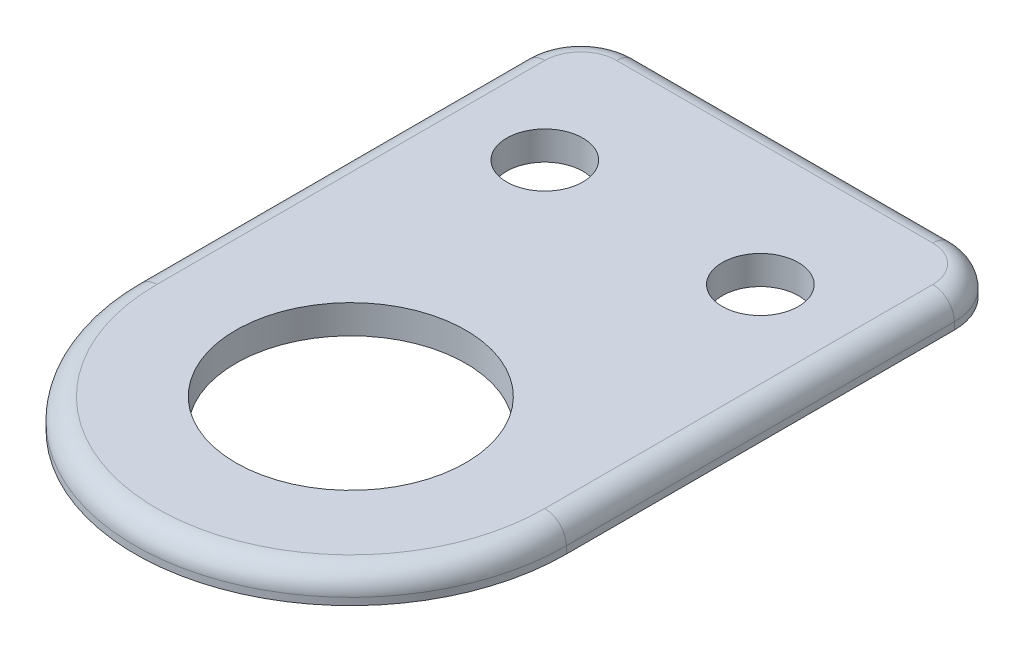
ISO-10303-21;
HEADER;
FILE_DESCRIPTION(('STEP AP214'),'2;1');
FILE_NAME('part.step','',(''),(''),'','','');
FILE_SCHEMA(('AUTOMOTIVE_DESIGN { 1 0 10303 214 1 1 1 1 }'));
ENDSEC;
DATA;
#1=APPLICATION_CONTEXT('core data for automotive mechanical design processes');
#2=APPLICATION_PROTOCOL_DEFINITION('international standard','automotive_design',2000,#1);
#3=PRODUCT_CONTEXT('',#1,'mechanical');
#4=PRODUCT('Part','Part','',(#3));
#5=PRODUCT_RELATED_PRODUCT_CATEGORY('part','',(#4));
#6=PRODUCT_DEFINITION_FORMATION('','',#4);
#7=PRODUCT_DEFINITION_CONTEXT('part definition',#1,'design');
#8=PRODUCT_DEFINITION('design','',#6,#7);
#9=PRODUCT_DEFINITION_SHAPE('','',#8);
#10=(LENGTH_UNIT() NAMED_UNIT(*) SI_UNIT(.MILLI.,.METRE.));
#11=(NAMED_UNIT(*) PLANE_ANGLE_UNIT() SI_UNIT($,.RADIAN.));
#12=(NAMED_UNIT(*) SI_UNIT($,.STERADIAN.) SOLID_ANGLE_UNIT());
#13=UNCERTAINTY_MEASURE_WITH_UNIT(LENGTH_MEASURE(1.E-05),#10,'distance_accuracy_value','');
#14=(GEOMETRIC_REPRESENTATION_CONTEXT(3) GLOBAL_UNCERTAINTY_ASSIGNED_CONTEXT((#13)) GLOBAL_UNIT_ASSIGNED_CONTEXT((#10,
#11,#12)) REPRESENTATION_CONTEXT('',''));
#15=CARTESIAN_POINT('',(0.,0.,0.));
#16=DIRECTION('',(0.,0.,1.));
#17=DIRECTION('',(1.,0.,0.));
#18=AXIS2_PLACEMENT_3D('',#15,#16,#17);
#19=CARTESIAN_POINT('',(0.,2.,0.));
#20=DIRECTION('',(0.,1.,0.));
#21=DIRECTION('',(0.,0.,1.));
#22=AXIS2_PLACEMENT_3D('',#19,#20,#21);
#23=PLANE('',#22);
#24=CARTESIAN_POINT('',(0.,2.,0.));
#25=DIRECTION('',(0.,1.,0.));
#26=DIRECTION('',(0.,0.,1.));
#27=AXIS2_PLACEMENT_3D('',#24,#25,#26);
#28=CIRCLE('',#27,13.5);
#29=CARTESIAN_POINT('',(-13.5,2.,0.));
#30=VERTEX_POINT('',#29);
#31=CARTESIAN_POINT('',(13.5,2.,0.));
#32=VERTEX_POINT('',#31);
#33=EDGE_CURVE('E196',#30,#32,#28,.T.);
#34=ORIENTED_EDGE('',*,*,#33,.T.);
#35=DIRECTION('',(0.,0.,-1.));
#36=VECTOR('',#35,1.);
#37=CARTESIAN_POINT('',(13.5,2.,-27.));
#38=LINE('',#37,#36);
#39=CARTESIAN_POINT('',(13.5,2.,-27.));
#40=VERTEX_POINT('',#39);
#41=EDGE_CURVE('E211',#32,#40,#38,.T.);
#42=ORIENTED_EDGE('',*,*,#41,.T.);
#43=CARTESIAN_POINT('',(11.,2.,-27.));
#44=DIRECTION('',(0.,1.,0.));
#45=DIRECTION('',(0.,0.,1.));
#46=AXIS2_PLACEMENT_3D('',#43,#44,#45);
#47=CIRCLE('',#46,2.5);
#48=CARTESIAN_POINT('',(11.,2.,-29.5));
#49=VERTEX_POINT('',#48);
#50=EDGE_CURVE('E208',#40,#49,#47,.T.);
#51=ORIENTED_EDGE('',*,*,#50,.T.);
#52=DIRECTION('',(1.,0.,0.));
#53=VECTOR('',#52,1.);
#54=CARTESIAN_POINT('',(0.,2.,-29.5));
#55=LINE('',#54,#53);
#56=CARTESIAN_POINT('',(-11.,2.,-29.5));
#57=VERTEX_POINT('',#56);
#58=EDGE_CURVE('E205',#49,#57,#55,.F.);
#59=ORIENTED_EDGE('',*,*,#58,.T.);
#60=CARTESIAN_POINT('',(-11.,2.,-27.));
#61=DIRECTION('',(0.,1.,0.));
#62=DIRECTION('',(0.,0.,1.));
#63=AXIS2_PLACEMENT_3D('',#60,#61,#62);
#64=CIRCLE('',#63,2.5);
#65=CARTESIAN_POINT('',(-13.5,2.,-27.));
#66=VERTEX_POINT('',#65);
#67=EDGE_CURVE('E202',#57,#66,#64,.T.);
#68=ORIENTED_EDGE('',*,*,#67,.T.);
#69=DIRECTION('',(0.,0.,-1.));
#70=VECTOR('',#69,1.);
#71=CARTESIAN_POINT('',(-13.5,2.,0.));
#72=LINE('',#71,#70);
#73=EDGE_CURVE('E199',#66,#30,#72,.F.);
#74=ORIENTED_EDGE('',*,*,#73,.T.);
#75=EDGE_LOOP('',(#34,#42,#51,#59,#68,#74));
#76=FACE_BOUND('',#75,.T.);
#77=CARTESIAN_POINT('',(-7.5,2.,-21.));
#78=DIRECTION('',(0.,1.,0.));
#79=DIRECTION('',(0.,0.,1.));
#80=AXIS2_PLACEMENT_3D('',#77,#78,#79);
#81=CIRCLE('',#80,2.65);
#82=CARTESIAN_POINT('',(-7.5,2.,-18.35));
#83=VERTEX_POINT('',#82);
#84=EDGE_CURVE('E250',#83,#83,#81,.T.);
#85=ORIENTED_EDGE('',*,*,#84,.F.);
#86=EDGE_LOOP('',(#85));
#87=FACE_BOUND('',#86,.T.);
#88=CARTESIAN_POINT('',(7.5,2.,-21.));
#89=DIRECTION('',(0.,1.,0.));
#90=DIRECTION('',(0.,0.,1.));
#91=AXIS2_PLACEMENT_3D('',#88,#89,#90);
#92=CIRCLE('',#91,2.65);
#93=CARTESIAN_POINT('',(7.5,2.,-18.35));
#94=VERTEX_POINT('',#93);
#95=EDGE_CURVE('E262',#94,#94,#92,.T.);
#96=ORIENTED_EDGE('',*,*,#95,.F.);
#97=EDGE_LOOP('',(#96));
#98=FACE_BOUND('',#97,.T.);
#99=CARTESIAN_POINT('',(0.,2.,0.));
#100=DIRECTION('',(0.,1.,0.));
#101=DIRECTION('',(0.,0.,1.));
#102=AXIS2_PLACEMENT_3D('',#99,#100,#101);
#103=CIRCLE('',#102,8.);
#104=CARTESIAN_POINT('',(0.,2.,8.));
#105=VERTEX_POINT('',#104);
#106=EDGE_CURVE('E164',#105,#105,#103,.T.);
#107=ORIENTED_EDGE('',*,*,#106,.F.);
#108=EDGE_LOOP('',(#107));
#109=FACE_BOUND('',#108,.T.);
#110=ADVANCED_FACE('F64',(#76,#87,#98,#109),#23,.T.);
#111=CARTESIAN_POINT('',(0.,0.,0.));
#112=DIRECTION('',(0.,1.,0.));
#113=DIRECTION('',(0.,0.,1.));
#114=AXIS2_PLACEMENT_3D('',#111,#112,#113);
#115=PLANE('',#114);
#116=CARTESIAN_POINT('',(-7.5,0.,-21.));
#117=DIRECTION('',(0.,1.,0.));
#118=DIRECTION('',(0.,0.,1.));
#119=AXIS2_PLACEMENT_3D('',#116,#117,#118);
#120=CIRCLE('',#119,2.65);
#121=CARTESIAN_POINT('',(-7.5,0.,-18.35));
#122=VERTEX_POINT('',#121);
#123=EDGE_CURVE('E256',#122,#122,#120,.T.);
#124=ORIENTED_EDGE('',*,*,#123,.T.);
#125=EDGE_LOOP('',(#124));
#126=FACE_BOUND('',#125,.T.);
#127=CARTESIAN_POINT('',(7.5,0.,-21.));
#128=DIRECTION('',(0.,1.,0.));
#129=DIRECTION('',(0.,0.,1.));
#130=AXIS2_PLACEMENT_3D('',#127,#128,#129);
#131=CIRCLE('',#130,2.65);
#132=CARTESIAN_POINT('',(7.5,0.,-18.35));
#133=VERTEX_POINT('',#132);
#134=EDGE_CURVE('E268',#133,#133,#131,.T.);
#135=ORIENTED_EDGE('',*,*,#134,.T.);
#136=EDGE_LOOP('',(#135));
#137=FACE_BOUND('',#136,.T.);
#138=DIRECTION('',(1.,0.,0.));
#139=VECTOR('',#138,1.);
#140=CARTESIAN_POINT('',(0.,0.,-31.));
#141=LINE('',#140,#139);
#142=CARTESIAN_POINT('',(-11.,0.,-31.));
#143=VERTEX_POINT('',#142);
#144=CARTESIAN_POINT('',(11.,0.,-31.));
#145=VERTEX_POINT('',#144);
#146=EDGE_CURVE('E160',#143,#145,#141,.T.);
#147=ORIENTED_EDGE('',*,*,#146,.T.);
#148=CARTESIAN_POINT('',(11.,0.,-27.));
#149=DIRECTION('',(0.,1.,0.));
#150=DIRECTION('',(0.,0.,1.));
#151=AXIS2_PLACEMENT_3D('',#148,#149,#150);
#152=CIRCLE('',#151,4.);
#153=CARTESIAN_POINT('',(15.,0.,-27.));
#154=VERTEX_POINT('',#153);
#155=EDGE_CURVE('E158',#145,#154,#152,.F.);
#156=ORIENTED_EDGE('',*,*,#155,.T.);
#157=DIRECTION('',(0.,0.,-1.));
#158=VECTOR('',#157,1.);
#159=CARTESIAN_POINT('',(15.,0.,0.));
#160=LINE('',#159,#158);
#161=CARTESIAN_POINT('',(15.,0.,0.));
#162=VERTEX_POINT('',#161);
#163=EDGE_CURVE('E140',#162,#154,#160,.T.);
#164=ORIENTED_EDGE('',*,*,#163,.F.);
#165=CARTESIAN_POINT('',(0.,0.,0.));
#166=DIRECTION('',(0.,1.,0.));
#167=DIRECTION('',(0.,0.,1.));
#168=AXIS2_PLACEMENT_3D('',#165,#166,#167);
#169=CIRCLE('',#168,15.);
#170=CARTESIAN_POINT('',(-15.,0.,0.));
#171=VERTEX_POINT('',#170);
#172=EDGE_CURVE('E155',#162,#171,#169,.F.);
#173=ORIENTED_EDGE('',*,*,#172,.T.);
#174=DIRECTION('',(0.,0.,-1.));
#175=VECTOR('',#174,1.);
#176=CARTESIAN_POINT('',(-15.,0.,0.));
#177=LINE('',#176,#175);
#178=CARTESIAN_POINT('',(-15.,0.,-27.));
#179=VERTEX_POINT('',#178);
#180=EDGE_CURVE('E174',#171,#179,#177,.T.);
#181=ORIENTED_EDGE('',*,*,#180,.T.);
#182=CARTESIAN_POINT('',(-11.,0.,-27.));
#183=DIRECTION('',(0.,1.,0.));
#184=DIRECTION('',(0.,0.,1.));
#185=AXIS2_PLACEMENT_3D('',#182,#183,#184);
#186=CIRCLE('',#185,4.);
#187=EDGE_CURVE('E185',#179,#143,#186,.F.);
#188=ORIENTED_EDGE('',*,*,#187,.T.);
#189=EDGE_LOOP('',(#147,#156,#164,#173,#181,#188));
#190=FACE_BOUND('',#189,.T.);
#191=CARTESIAN_POINT('',(0.,0.,0.));
#192=DIRECTION('',(0.,1.,0.));
#193=DIRECTION('',(0.,0.,1.));
#194=AXIS2_PLACEMENT_3D('',#191,#192,#193);
#195=CIRCLE('',#194,8.);
#196=CARTESIAN_POINT('',(0.,0.,8.));
#197=VERTEX_POINT('',#196);
#198=EDGE_CURVE('E168',#197,#197,#195,.T.);
#199=ORIENTED_EDGE('',*,*,#198,.T.);
#200=EDGE_LOOP('',(#199));
#201=FACE_BOUND('',#200,.T.);
#202=ADVANCED_FACE('F152',(#126,#137,#190,#201),#115,.F.);
#203=CARTESIAN_POINT('',(0.,2.,0.));
#204=DIRECTION('',(0.,-1.,0.));
#205=DIRECTION('',(0.,0.,-1.));
#206=AXIS2_PLACEMENT_3D('',#203,#204,#205);
#207=CYLINDRICAL_SURFACE('',#206,15.);
#208=DIRECTION('',(0.,-1.,0.));
#209=VECTOR('',#208,1.);
#210=CARTESIAN_POINT('',(15.,2.,0.));
#211=LINE('',#210,#209);
#212=CARTESIAN_POINT('',(15.,0.5,0.));
#213=VERTEX_POINT('',#212);
#214=EDGE_CURVE('E136',#213,#162,#211,.T.);
#215=ORIENTED_EDGE('',*,*,#214,.F.);
#216=CARTESIAN_POINT('',(0.,0.5,0.));
#217=DIRECTION('',(0.,1.,0.));
#218=DIRECTION('',(0.,0.,1.));
#219=AXIS2_PLACEMENT_3D('',#216,#217,#218);
#220=CIRCLE('',#219,15.);
#221=CARTESIAN_POINT('',(-15.,0.5,0.));
#222=VERTEX_POINT('',#221);
#223=EDGE_CURVE('E12',#213,#222,#220,.F.);
#224=ORIENTED_EDGE('',*,*,#223,.T.);
#225=DIRECTION('',(0.,-1.,0.));
#226=VECTOR('',#225,1.);
#227=CARTESIAN_POINT('',(-15.,2.,0.));
#228=LINE('',#227,#226);
#229=EDGE_CURVE('E147',#222,#171,#228,.T.);
#230=ORIENTED_EDGE('',*,*,#229,.T.);
#231=ORIENTED_EDGE('',*,*,#172,.F.);
#232=EDGE_LOOP('',(#215,#224,#230,#231));
#233=FACE_BOUND('',#232,.T.);
#234=ADVANCED_FACE('F162',(#233),#207,.T.);
#235=CARTESIAN_POINT('',(15.,2.,0.));
#236=DIRECTION('',(-1.,0.,0.));
#237=DIRECTION('',(0.,0.,1.));
#238=AXIS2_PLACEMENT_3D('',#235,#236,#237);
#239=PLANE('',#238);
#240=DIRECTION('',(0.,-1.,0.));
#241=VECTOR('',#240,1.);
#242=CARTESIAN_POINT('',(15.,2.,-27.));
#243=LINE('',#242,#241);
#244=CARTESIAN_POINT('',(15.,0.5,-27.));
#245=VERTEX_POINT('',#244);
#246=EDGE_CURVE('E190',#154,#245,#243,.F.);
#247=ORIENTED_EDGE('',*,*,#246,.T.);
#248=DIRECTION('',(0.,0.,-1.));
#249=VECTOR('',#248,1.);
#250=CARTESIAN_POINT('',(15.,0.5,0.));
#251=LINE('',#250,#249);
#252=EDGE_CURVE('E143',#245,#213,#251,.F.);
#253=ORIENTED_EDGE('',*,*,#252,.T.);
#254=ORIENTED_EDGE('',*,*,#214,.T.);
#255=ORIENTED_EDGE('',*,*,#163,.T.);
#256=EDGE_LOOP('',(#247,#253,#254,#255));
#257=FACE_BOUND('',#256,.T.);
#258=ADVANCED_FACE('F139',(#257),#239,.F.);
#259=CARTESIAN_POINT('',(0.,2.,-31.));
#260=DIRECTION('',(0.,0.,-1.));
#261=DIRECTION('',(-1.,0.,0.));
#262=AXIS2_PLACEMENT_3D('',#259,#260,#261);
#263=PLANE('',#262);
#264=DIRECTION('',(0.,-1.,0.));
#265=VECTOR('',#264,1.);
#266=CARTESIAN_POINT('',(-11.,2.,-31.));
#267=LINE('',#266,#265);
#268=CARTESIAN_POINT('',(-11.,0.5,-31.));
#269=VERTEX_POINT('',#268);
#270=EDGE_CURVE('E146',#143,#269,#267,.F.);
#271=ORIENTED_EDGE('',*,*,#270,.T.);
#272=DIRECTION('',(1.,0.,0.));
#273=VECTOR('',#272,1.);
#274=CARTESIAN_POINT('',(0.,0.5,-31.));
#275=LINE('',#274,#273);
#276=CARTESIAN_POINT('',(11.,0.5,-31.));
#277=VERTEX_POINT('',#276);
#278=EDGE_CURVE('E220',#269,#277,#275,.T.);
#279=ORIENTED_EDGE('',*,*,#278,.T.);
#280=DIRECTION('',(0.,-1.,0.));
#281=VECTOR('',#280,1.);
#282=CARTESIAN_POINT('',(11.,0.,-31.));
#283=LINE('',#282,#281);
#284=EDGE_CURVE('E182',#277,#145,#283,.T.);
#285=ORIENTED_EDGE('',*,*,#284,.T.);
#286=ORIENTED_EDGE('',*,*,#146,.F.);
#287=EDGE_LOOP('',(#271,#279,#285,#286));
#288=FACE_BOUND('',#287,.T.);
#289=ADVANCED_FACE('F290',(#288),#263,.T.);
#290=CARTESIAN_POINT('',(-15.,2.,0.));
#291=DIRECTION('',(-1.,0.,0.));
#292=DIRECTION('',(0.,0.,1.));
#293=AXIS2_PLACEMENT_3D('',#290,#291,#292);
#294=PLANE('',#293);
#295=ORIENTED_EDGE('',*,*,#229,.F.);
#296=DIRECTION('',(0.,0.,-1.));
#297=VECTOR('',#296,1.);
#298=CARTESIAN_POINT('',(-15.,0.5,0.));
#299=LINE('',#298,#297);
#300=CARTESIAN_POINT('',(-15.,0.5,-27.));
#301=VERTEX_POINT('',#300);
#302=EDGE_CURVE('E74',#222,#301,#299,.T.);
#303=ORIENTED_EDGE('',*,*,#302,.T.);
#304=DIRECTION('',(0.,-1.,0.));
#305=VECTOR('',#304,1.);
#306=CARTESIAN_POINT('',(-15.,2.,-27.));
#307=LINE('',#306,#305);
#308=EDGE_CURVE('E193',#301,#179,#307,.T.);
#309=ORIENTED_EDGE('',*,*,#308,.T.);
#310=ORIENTED_EDGE('',*,*,#180,.F.);
#311=EDGE_LOOP('',(#295,#303,#309,#310));
#312=FACE_BOUND('',#311,.T.);
#313=ADVANCED_FACE('F280',(#312),#294,.T.);
#314=CARTESIAN_POINT('',(0.,2.,0.));
#315=DIRECTION('',(0.,-1.,0.));
#316=DIRECTION('',(0.,0.,-1.));
#317=AXIS2_PLACEMENT_3D('',#314,#315,#316);
#318=CYLINDRICAL_SURFACE('',#317,8.);
#319=ORIENTED_EDGE('',*,*,#106,.T.);
#320=EDGE_LOOP('',(#319));
#321=FACE_BOUND('',#320,.T.);
#322=ORIENTED_EDGE('',*,*,#198,.F.);
#323=EDGE_LOOP('',(#322));
#324=FACE_BOUND('',#323,.T.);
#325=ADVANCED_FACE('F277',(#321,#324),#318,.F.);
#326=CARTESIAN_POINT('',(7.5,2.,-21.));
#327=DIRECTION('',(0.,1.,0.));
#328=DIRECTION('',(0.,0.,1.));
#329=AXIS2_PLACEMENT_3D('',#326,#327,#328);
#330=CYLINDRICAL_SURFACE('',#329,2.65);
#331=ORIENTED_EDGE('',*,*,#134,.F.);
#332=EDGE_LOOP('',(#331));
#333=FACE_BOUND('',#332,.T.);
#334=ORIENTED_EDGE('',*,*,#95,.T.);
#335=EDGE_LOOP('',(#334));
#336=FACE_BOUND('',#335,.T.);
#337=ADVANCED_FACE('F279',(#333,#336),#330,.F.);
#338=CARTESIAN_POINT('',(-7.5,2.,-21.));
#339=DIRECTION('',(0.,1.,0.));
#340=DIRECTION('',(0.,0.,1.));
#341=AXIS2_PLACEMENT_3D('',#338,#339,#340);
#342=CYLINDRICAL_SURFACE('',#341,2.65);
#343=ORIENTED_EDGE('',*,*,#123,.F.);
#344=EDGE_LOOP('',(#343));
#345=FACE_BOUND('',#344,.T.);
#346=ORIENTED_EDGE('',*,*,#84,.T.);
#347=EDGE_LOOP('',(#346));
#348=FACE_BOUND('',#347,.T.);
#349=ADVANCED_FACE('F286',(#345,#348),#342,.F.);
#350=CARTESIAN_POINT('',(11.,2.,-27.));
#351=DIRECTION('',(0.,1.,0.));
#352=DIRECTION('',(0.,0.,1.));
#353=AXIS2_PLACEMENT_3D('',#350,#351,#352);
#354=CYLINDRICAL_SURFACE('',#353,4.);
#355=ORIENTED_EDGE('',*,*,#284,.F.);
#356=CARTESIAN_POINT('',(11.,0.5,-27.));
#357=DIRECTION('',(0.,1.,0.));
#358=DIRECTION('',(0.,0.,1.));
#359=AXIS2_PLACEMENT_3D('',#356,#357,#358);
#360=CIRCLE('',#359,4.);
#361=EDGE_CURVE('E217',#277,#245,#360,.F.);
#362=ORIENTED_EDGE('',*,*,#361,.T.);
#363=ORIENTED_EDGE('',*,*,#246,.F.);
#364=ORIENTED_EDGE('',*,*,#155,.F.);
#365=EDGE_LOOP('',(#355,#362,#363,#364));
#366=FACE_BOUND('',#365,.T.);
#367=ADVANCED_FACE('F309',(#366),#354,.T.);
#368=CARTESIAN_POINT('',(-11.,2.,-27.));
#369=DIRECTION('',(0.,-1.,0.));
#370=DIRECTION('',(0.,0.,-1.));
#371=AXIS2_PLACEMENT_3D('',#368,#369,#370);
#372=CYLINDRICAL_SURFACE('',#371,4.);
#373=ORIENTED_EDGE('',*,*,#308,.F.);
#374=CARTESIAN_POINT('',(-11.,0.5,-27.));
#375=DIRECTION('',(0.,1.,0.));
#376=DIRECTION('',(0.,0.,1.));
#377=AXIS2_PLACEMENT_3D('',#374,#375,#376);
#378=CIRCLE('',#377,4.);
#379=EDGE_CURVE('E223',#301,#269,#378,.F.);
#380=ORIENTED_EDGE('',*,*,#379,.T.);
#381=ORIENTED_EDGE('',*,*,#270,.F.);
#382=ORIENTED_EDGE('',*,*,#187,.F.);
#383=EDGE_LOOP('',(#373,#380,#381,#382));
#384=FACE_BOUND('',#383,.T.);
#385=ADVANCED_FACE('F312',(#384),#372,.T.);
#386=CARTESIAN_POINT('',(-11.,0.5,-27.));
#387=DIRECTION('',(0.,1.,0.));
#388=DIRECTION('',(0.,0.,1.));
#389=AXIS2_PLACEMENT_3D('',#386,#387,#388);
#390=TOROIDAL_SURFACE('',#389,2.5,1.5);
#391=CARTESIAN_POINT('',(-11.,0.5,-29.5));
#392=DIRECTION('',(1.,0.,0.));
#393=DIRECTION('',(0.,0.,-1.));
#394=AXIS2_PLACEMENT_3D('',#391,#392,#393);
#395=CIRCLE('',#394,1.5);
#396=EDGE_CURVE('E241',#269,#57,#395,.T.);
#397=ORIENTED_EDGE('',*,*,#396,.F.);
#398=ORIENTED_EDGE('',*,*,#379,.F.);
#399=CARTESIAN_POINT('',(-13.5,0.5,-27.));
#400=DIRECTION('',(0.,0.,1.));
#401=DIRECTION('',(1.,0.,0.));
#402=AXIS2_PLACEMENT_3D('',#399,#400,#401);
#403=CIRCLE('',#402,1.5);
#404=EDGE_CURVE('E68',#66,#301,#403,.T.);
#405=ORIENTED_EDGE('',*,*,#404,.F.);
#406=ORIENTED_EDGE('',*,*,#67,.F.);
#407=EDGE_LOOP('',(#397,#398,#405,#406));
#408=FACE_BOUND('',#407,.T.);
#409=ADVANCED_FACE('F66',(#408),#390,.T.);
#410=CARTESIAN_POINT('',(-13.5,0.5,0.));
#411=DIRECTION('',(0.,0.,-1.));
#412=DIRECTION('',(-1.,0.,0.));
#413=AXIS2_PLACEMENT_3D('',#410,#411,#412);
#414=CYLINDRICAL_SURFACE('',#413,1.5);
#415=ORIENTED_EDGE('',*,*,#404,.T.);
#416=ORIENTED_EDGE('',*,*,#302,.F.);
#417=CARTESIAN_POINT('',(-13.5,0.5,0.));
#418=DIRECTION('',(0.,0.,1.));
#419=DIRECTION('',(1.,0.,0.));
#420=AXIS2_PLACEMENT_3D('',#417,#418,#419);
#421=CIRCLE('',#420,1.5);
#422=EDGE_CURVE('E238',#30,#222,#421,.T.);
#423=ORIENTED_EDGE('',*,*,#422,.F.);
#424=ORIENTED_EDGE('',*,*,#73,.F.);
#425=EDGE_LOOP('',(#415,#416,#423,#424));
#426=FACE_BOUND('',#425,.T.);
#427=ADVANCED_FACE('F331',(#426),#414,.T.);
#428=CARTESIAN_POINT('',(0.,0.5,-29.5));
#429=DIRECTION('',(1.,0.,0.));
#430=DIRECTION('',(0.,0.,-1.));
#431=AXIS2_PLACEMENT_3D('',#428,#429,#430);
#432=CYLINDRICAL_SURFACE('',#431,1.5);
#433=ORIENTED_EDGE('',*,*,#396,.T.);
#434=ORIENTED_EDGE('',*,*,#58,.F.);
#435=CARTESIAN_POINT('',(11.,0.5,-29.5));
#436=DIRECTION('',(1.,0.,0.));
#437=DIRECTION('',(0.,0.,-1.));
#438=AXIS2_PLACEMENT_3D('',#435,#436,#437);
#439=CIRCLE('',#438,1.5);
#440=EDGE_CURVE('E234',#277,#49,#439,.T.);
#441=ORIENTED_EDGE('',*,*,#440,.F.);
#442=ORIENTED_EDGE('',*,*,#278,.F.);
#443=EDGE_LOOP('',(#433,#434,#441,#442));
#444=FACE_BOUND('',#443,.T.);
#445=ADVANCED_FACE('F328',(#444),#432,.T.);
#446=CARTESIAN_POINT('',(0.,0.5,0.));
#447=DIRECTION('',(0.,1.,0.));
#448=DIRECTION('',(0.,0.,1.));
#449=AXIS2_PLACEMENT_3D('',#446,#447,#448);
#450=TOROIDAL_SURFACE('',#449,13.5,1.5);
#451=ORIENTED_EDGE('',*,*,#422,.T.);
#452=ORIENTED_EDGE('',*,*,#223,.F.);
#453=CARTESIAN_POINT('',(13.5,0.5,0.));
#454=DIRECTION('',(0.,0.,-1.));
#455=DIRECTION('',(-1.,0.,0.));
#456=AXIS2_PLACEMENT_3D('',#453,#454,#455);
#457=CIRCLE('',#456,1.5);
#458=EDGE_CURVE('E231',#32,#213,#457,.T.);
#459=ORIENTED_EDGE('',*,*,#458,.F.);
#460=ORIENTED_EDGE('',*,*,#33,.F.);
#461=EDGE_LOOP('',(#451,#452,#459,#460));
#462=FACE_BOUND('',#461,.T.);
#463=ADVANCED_FACE('F324',(#462),#450,.T.);
#464=CARTESIAN_POINT('',(11.,0.5,-27.));
#465=DIRECTION('',(0.,1.,0.));
#466=DIRECTION('',(0.,0.,1.));
#467=AXIS2_PLACEMENT_3D('',#464,#465,#466);
#468=TOROIDAL_SURFACE('',#467,2.5,1.5);
#469=ORIENTED_EDGE('',*,*,#440,.T.);
#470=ORIENTED_EDGE('',*,*,#50,.F.);
#471=CARTESIAN_POINT('',(13.5,0.5,-27.));
#472=DIRECTION('',(0.,0.,1.));
#473=DIRECTION('',(1.,0.,0.));
#474=AXIS2_PLACEMENT_3D('',#471,#472,#473);
#475=CIRCLE('',#474,1.5);
#476=EDGE_CURVE('E228',#245,#40,#475,.T.);
#477=ORIENTED_EDGE('',*,*,#476,.F.);
#478=ORIENTED_EDGE('',*,*,#361,.F.);
#479=EDGE_LOOP('',(#469,#470,#477,#478));
#480=FACE_BOUND('',#479,.T.);
#481=ADVANCED_FACE('F320',(#480),#468,.T.);
#482=CARTESIAN_POINT('',(13.5,0.5,0.));
#483=DIRECTION('',(0.,0.,1.));
#484=DIRECTION('',(1.,0.,0.));
#485=AXIS2_PLACEMENT_3D('',#482,#483,#484);
#486=CYLINDRICAL_SURFACE('',#485,1.5);
#487=ORIENTED_EDGE('',*,*,#458,.T.);
#488=ORIENTED_EDGE('',*,*,#252,.F.);
#489=ORIENTED_EDGE('',*,*,#476,.T.);
#490=ORIENTED_EDGE('',*,*,#41,.F.);
#491=EDGE_LOOP('',(#487,#488,#489,#490));
#492=FACE_BOUND('',#491,.T.);
#493=ADVANCED_FACE('F317',(#492),#486,.T.);
#494=CLOSED_SHELL('',(#110,#202,#234,#258,#289,#313,#325,#337,#349,#367,#385,#409,#427,#445,
#463,#481,#493));
#495=MANIFOLD_SOLID_BREP('B2',#494);
#496=ADVANCED_BREP_SHAPE_REPRESENTATION('',(#18,#495),#14);
#497=SHAPE_DEFINITION_REPRESENTATION(#9,#496);
ENDSEC;
END-ISO-10303-21;
